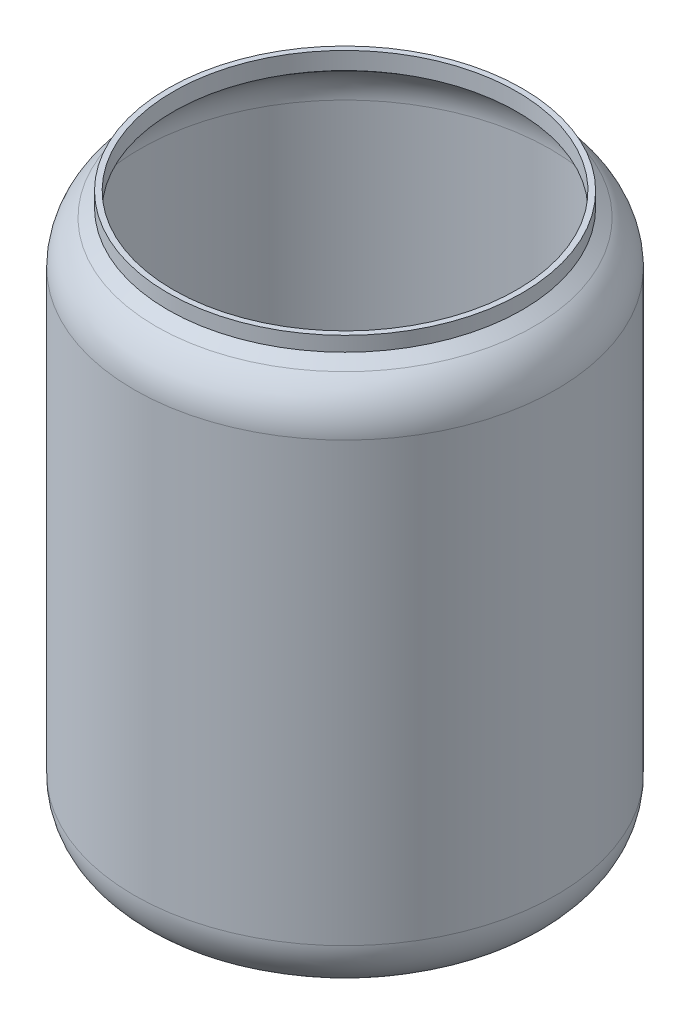
ISO-10303-21;
HEADER;
FILE_DESCRIPTION(('STEP AP214'),'2;1');
FILE_NAME('part.step','',(''),(''),'','','');
FILE_SCHEMA(('AUTOMOTIVE_DESIGN { 1 0 10303 214 1 1 1 1 }'));
ENDSEC;
DATA;
#1=APPLICATION_CONTEXT('core data for automotive mechanical design processes');
#2=APPLICATION_PROTOCOL_DEFINITION('international standard','automotive_design',2000,#1);
#3=PRODUCT_CONTEXT('',#1,'mechanical');
#4=PRODUCT('Part','Part','',(#3));
#5=PRODUCT_RELATED_PRODUCT_CATEGORY('part','',(#4));
#6=PRODUCT_DEFINITION_FORMATION('','',#4);
#7=PRODUCT_DEFINITION_CONTEXT('part definition',#1,'design');
#8=PRODUCT_DEFINITION('design','',#6,#7);
#9=PRODUCT_DEFINITION_SHAPE('','',#8);
#10=(LENGTH_UNIT() NAMED_UNIT(*) SI_UNIT(.MILLI.,.METRE.));
#11=(NAMED_UNIT(*) PLANE_ANGLE_UNIT() SI_UNIT($,.RADIAN.));
#12=(NAMED_UNIT(*) SI_UNIT($,.STERADIAN.) SOLID_ANGLE_UNIT());
#13=UNCERTAINTY_MEASURE_WITH_UNIT(LENGTH_MEASURE(1.E-05),#10,'distance_accuracy_value','');
#14=(GEOMETRIC_REPRESENTATION_CONTEXT(3) GLOBAL_UNCERTAINTY_ASSIGNED_CONTEXT((#13)) GLOBAL_UNIT_ASSIGNED_CONTEXT((#10,
#11,#12)) REPRESENTATION_CONTEXT('',''));
#15=CARTESIAN_POINT('',(0.,0.,0.));
#16=DIRECTION('',(0.,0.,1.));
#17=DIRECTION('',(1.,0.,0.));
#18=AXIS2_PLACEMENT_3D('',#15,#16,#17);
#19=CARTESIAN_POINT('',(28.9999999999999,1.,0.));
#20=DIRECTION('',(0.,-1.,0.));
#21=DIRECTION('',(0.,0.,-1.));
#22=AXIS2_PLACEMENT_3D('',#19,#20,#21);
#23=PLANE('',#22);
#24=CARTESIAN_POINT('',(0.,1.,0.));
#25=DIRECTION('',(0.,1.,0.));
#26=DIRECTION('',(0.,0.,1.));
#27=AXIS2_PLACEMENT_3D('',#24,#25,#26);
#28=CIRCLE('',#27,28.9999999999999);
#29=CARTESIAN_POINT('',(0.,1.,28.9999999999999));
#30=VERTEX_POINT('',#29);
#31=EDGE_CURVE('E10',#30,#30,#28,.T.);
#32=ORIENTED_EDGE('',*,*,#31,.T.);
#33=EDGE_LOOP('',(#32));
#34=FACE_BOUND('',#33,.T.);
#35=ADVANCED_FACE('F28',(#34),#23,.F.);
#36=CARTESIAN_POINT('',(0.,10.,0.));
#37=DIRECTION('',(0.,1.,0.));
#38=DIRECTION('',(0.,0.,1.));
#39=AXIS2_PLACEMENT_3D('',#36,#37,#38);
#40=TOROIDAL_SURFACE('',#39,29.,9.);
#41=ORIENTED_EDGE('',*,*,#31,.F.);
#42=EDGE_LOOP('',(#41));
#43=FACE_BOUND('',#42,.T.);
#44=CARTESIAN_POINT('',(0.,10.0000000000001,0.));
#45=DIRECTION('',(0.,1.,0.));
#46=DIRECTION('',(0.,0.,1.));
#47=AXIS2_PLACEMENT_3D('',#44,#45,#46);
#48=CIRCLE('',#47,38.);
#49=CARTESIAN_POINT('',(0.,10.0000000000001,38.));
#50=VERTEX_POINT('',#49);
#51=EDGE_CURVE('E34',#50,#50,#48,.T.);
#52=ORIENTED_EDGE('',*,*,#51,.T.);
#53=EDGE_LOOP('',(#52));
#54=FACE_BOUND('',#53,.T.);
#55=ADVANCED_FACE('F84',(#43,#54),#40,.F.);
#56=CARTESIAN_POINT('',(0.,85.7638888888889,0.));
#57=DIRECTION('',(0.,1.,0.));
#58=DIRECTION('',(0.,0.,1.));
#59=AXIS2_PLACEMENT_3D('',#56,#57,#58);
#60=CYLINDRICAL_SURFACE('',#59,38.);
#61=ORIENTED_EDGE('',*,*,#51,.F.);
#62=EDGE_LOOP('',(#61));
#63=FACE_BOUND('',#62,.T.);
#64=CARTESIAN_POINT('',(0.,90.9311994992868,0.));
#65=DIRECTION('',(0.,1.,0.));
#66=DIRECTION('',(0.,0.,1.));
#67=AXIS2_PLACEMENT_3D('',#64,#65,#66);
#68=CIRCLE('',#67,38.);
#69=CARTESIAN_POINT('',(0.,90.9311994992868,38.));
#70=VERTEX_POINT('',#69);
#71=EDGE_CURVE('E38',#70,#70,#68,.T.);
#72=ORIENTED_EDGE('',*,*,#71,.T.);
#73=EDGE_LOOP('',(#72));
#74=FACE_BOUND('',#73,.T.);
#75=ADVANCED_FACE('F88',(#63,#74),#60,.F.);
#76=CARTESIAN_POINT('',(0.,90.9311994992868,0.));
#77=DIRECTION('',(0.,1.,0.));
#78=DIRECTION('',(0.,0.,1.));
#79=AXIS2_PLACEMENT_3D('',#76,#77,#78);
#80=TOROIDAL_SURFACE('',#79,29.,9.);
#81=ORIENTED_EDGE('',*,*,#71,.F.);
#82=EDGE_LOOP('',(#81));
#83=FACE_BOUND('',#82,.T.);
#84=CARTESIAN_POINT('',(0.,98.1900443689291,0.));
#85=DIRECTION('',(0.,1.,0.));
#86=DIRECTION('',(0.,0.,1.));
#87=AXIS2_PLACEMENT_3D('',#84,#85,#86);
#88=CIRCLE('',#87,34.3206363490158);
#89=CARTESIAN_POINT('',(0.,98.1900443689291,34.3206363490158));
#90=VERTEX_POINT('',#89);
#91=EDGE_CURVE('E42',#90,#90,#88,.T.);
#92=ORIENTED_EDGE('',*,*,#91,.T.);
#93=EDGE_LOOP('',(#92));
#94=FACE_BOUND('',#93,.T.);
#95=ADVANCED_FACE('F93',(#83,#94),#80,.F.);
#96=CARTESIAN_POINT('',(0.,100.072316893314,0.));
#97=DIRECTION('',(0.,-1.,0.));
#98=DIRECTION('',(0.,0.,-1.));
#99=AXIS2_PLACEMENT_3D('',#96,#97,#98);
#100=CONICAL_SURFACE('',#99,31.7526870736574,0.938272976554357);
#101=ORIENTED_EDGE('',*,*,#91,.F.);
#102=EDGE_LOOP('',(#101));
#103=FACE_BOUND('',#102,.T.);
#104=CARTESIAN_POINT('',(0.,100.072316893314,0.));
#105=DIRECTION('',(0.,1.,0.));
#106=DIRECTION('',(0.,0.,1.));
#107=AXIS2_PLACEMENT_3D('',#104,#105,#106);
#108=CIRCLE('',#107,31.7526870736574);
#109=CARTESIAN_POINT('',(0.,100.072316893314,31.7526870736574));
#110=VERTEX_POINT('',#109);
#111=EDGE_CURVE('E47',#110,#110,#108,.T.);
#112=ORIENTED_EDGE('',*,*,#111,.T.);
#113=EDGE_LOOP('',(#112));
#114=FACE_BOUND('',#113,.T.);
#115=ADVANCED_FACE('F99',(#103,#114),#100,.F.);
#116=CARTESIAN_POINT('',(0.,85.7638888888889,0.));
#117=DIRECTION('',(0.,1.,0.));
#118=DIRECTION('',(0.,0.,1.));
#119=AXIS2_PLACEMENT_3D('',#116,#117,#118);
#120=CYLINDRICAL_SURFACE('',#119,31.7526870736574);
#121=ORIENTED_EDGE('',*,*,#111,.F.);
#122=EDGE_LOOP('',(#121));
#123=FACE_BOUND('',#122,.T.);
#124=CARTESIAN_POINT('',(0.,103.28846027419,0.));
#125=DIRECTION('',(0.,1.,0.));
#126=DIRECTION('',(0.,0.,1.));
#127=AXIS2_PLACEMENT_3D('',#124,#125,#126);
#128=CIRCLE('',#127,31.7526870736574);
#129=CARTESIAN_POINT('',(0.,103.28846027419,31.7526870736574));
#130=VERTEX_POINT('',#129);
#131=EDGE_CURVE('E50',#130,#130,#128,.T.);
#132=ORIENTED_EDGE('',*,*,#131,.T.);
#133=EDGE_LOOP('',(#132));
#134=FACE_BOUND('',#133,.T.);
#135=ADVANCED_FACE('F103',(#123,#134),#120,.F.);
#136=CARTESIAN_POINT('',(31.7526870736574,103.28846027419,0.));
#137=DIRECTION('',(0.,-1.,0.));
#138=DIRECTION('',(0.,0.,-1.));
#139=AXIS2_PLACEMENT_3D('',#136,#137,#138);
#140=PLANE('',#139);
#141=ORIENTED_EDGE('',*,*,#131,.F.);
#142=EDGE_LOOP('',(#141));
#143=FACE_BOUND('',#142,.T.);
#144=CARTESIAN_POINT('',(0.,103.28846027419,0.));
#145=DIRECTION('',(0.,1.,0.));
#146=DIRECTION('',(0.,0.,1.));
#147=AXIS2_PLACEMENT_3D('',#144,#145,#146);
#148=CIRCLE('',#147,32.7526870736574);
#149=CARTESIAN_POINT('',(0.,103.28846027419,32.7526870736574));
#150=VERTEX_POINT('',#149);
#151=EDGE_CURVE('E53',#150,#150,#148,.T.);
#152=ORIENTED_EDGE('',*,*,#151,.T.);
#153=EDGE_LOOP('',(#152));
#154=FACE_BOUND('',#153,.T.);
#155=ADVANCED_FACE('F107',(#143,#154),#140,.F.);
#156=CARTESIAN_POINT('',(0.,85.7638888888889,0.));
#157=DIRECTION('',(0.,1.,0.));
#158=DIRECTION('',(0.,0.,1.));
#159=AXIS2_PLACEMENT_3D('',#156,#157,#158);
#160=CYLINDRICAL_SURFACE('',#159,32.7526870736574);
#161=ORIENTED_EDGE('',*,*,#151,.F.);
#162=EDGE_LOOP('',(#161));
#163=FACE_BOUND('',#162,.T.);
#164=CARTESIAN_POINT('',(0.,100.579196943385,0.));
#165=DIRECTION('',(0.,1.,0.));
#166=DIRECTION('',(0.,0.,1.));
#167=AXIS2_PLACEMENT_3D('',#164,#165,#166);
#168=CIRCLE('',#167,32.7526870736574);
#169=CARTESIAN_POINT('',(0.,100.579196943385,32.7526870736574));
#170=VERTEX_POINT('',#169);
#171=EDGE_CURVE('E56',#170,#170,#168,.T.);
#172=ORIENTED_EDGE('',*,*,#171,.T.);
#173=EDGE_LOOP('',(#172));
#174=FACE_BOUND('',#173,.T.);
#175=ADVANCED_FACE('F111',(#163,#174),#160,.T.);
#176=CARTESIAN_POINT('',(0.,98.9965826877783,0.));
#177=DIRECTION('',(0.,-1.,0.));
#178=DIRECTION('',(0.,0.,-1.));
#179=AXIS2_PLACEMENT_3D('',#176,#177,#178);
#180=CONICAL_SURFACE('',#179,34.9118181655731,0.938272976554358);
#181=ORIENTED_EDGE('',*,*,#171,.F.);
#182=EDGE_LOOP('',(#181));
#183=FACE_BOUND('',#182,.T.);
#184=CARTESIAN_POINT('',(0.,98.9965826877783,0.));
#185=DIRECTION('',(0.,1.,0.));
#186=DIRECTION('',(0.,0.,1.));
#187=AXIS2_PLACEMENT_3D('',#184,#185,#186);
#188=CIRCLE('',#187,34.9118181655731);
#189=CARTESIAN_POINT('',(0.,98.9965826877783,34.9118181655731));
#190=VERTEX_POINT('',#189);
#191=EDGE_CURVE('E59',#190,#190,#188,.T.);
#192=ORIENTED_EDGE('',*,*,#191,.T.);
#193=EDGE_LOOP('',(#192));
#194=FACE_BOUND('',#193,.T.);
#195=ADVANCED_FACE('F115',(#183,#194),#180,.T.);
#196=CARTESIAN_POINT('',(0.,90.9311994992868,0.));
#197=DIRECTION('',(0.,1.,0.));
#198=DIRECTION('',(0.,0.,1.));
#199=AXIS2_PLACEMENT_3D('',#196,#197,#198);
#200=TOROIDAL_SURFACE('',#199,29.,10.);
#201=ORIENTED_EDGE('',*,*,#191,.F.);
#202=EDGE_LOOP('',(#201));
#203=FACE_BOUND('',#202,.T.);
#204=CARTESIAN_POINT('',(0.,90.9311994992868,0.));
#205=DIRECTION('',(0.,1.,0.));
#206=DIRECTION('',(0.,0.,1.));
#207=AXIS2_PLACEMENT_3D('',#204,#205,#206);
#208=CIRCLE('',#207,39.);
#209=CARTESIAN_POINT('',(0.,90.9311994992868,39.));
#210=VERTEX_POINT('',#209);
#211=EDGE_CURVE('E62',#210,#210,#208,.T.);
#212=ORIENTED_EDGE('',*,*,#211,.T.);
#213=EDGE_LOOP('',(#212));
#214=FACE_BOUND('',#213,.T.);
#215=ADVANCED_FACE('F119',(#203,#214),#200,.T.);
#216=CARTESIAN_POINT('',(0.,85.7638888888889,0.));
#217=DIRECTION('',(0.,1.,0.));
#218=DIRECTION('',(0.,0.,1.));
#219=AXIS2_PLACEMENT_3D('',#216,#217,#218);
#220=CYLINDRICAL_SURFACE('',#219,39.);
#221=ORIENTED_EDGE('',*,*,#211,.F.);
#222=EDGE_LOOP('',(#221));
#223=FACE_BOUND('',#222,.T.);
#224=CARTESIAN_POINT('',(0.,10.0000000000001,0.));
#225=DIRECTION('',(0.,1.,0.));
#226=DIRECTION('',(0.,0.,1.));
#227=AXIS2_PLACEMENT_3D('',#224,#225,#226);
#228=CIRCLE('',#227,39.);
#229=CARTESIAN_POINT('',(0.,10.0000000000001,39.));
#230=VERTEX_POINT('',#229);
#231=EDGE_CURVE('E65',#230,#230,#228,.T.);
#232=ORIENTED_EDGE('',*,*,#231,.T.);
#233=EDGE_LOOP('',(#232));
#234=FACE_BOUND('',#233,.T.);
#235=ADVANCED_FACE('F80',(#223,#234),#220,.T.);
#236=CARTESIAN_POINT('',(0.,10.,0.));
#237=DIRECTION('',(0.,1.,0.));
#238=DIRECTION('',(0.,0.,1.));
#239=AXIS2_PLACEMENT_3D('',#236,#237,#238);
#240=TOROIDAL_SURFACE('',#239,29.,10.);
#241=ORIENTED_EDGE('',*,*,#231,.F.);
#242=EDGE_LOOP('',(#241));
#243=FACE_BOUND('',#242,.T.);
#244=CARTESIAN_POINT('',(0.,0.,0.));
#245=DIRECTION('',(0.,1.,0.));
#246=DIRECTION('',(0.,0.,1.));
#247=AXIS2_PLACEMENT_3D('',#244,#245,#246);
#248=CIRCLE('',#247,28.9999999999999);
#249=CARTESIAN_POINT('',(0.,0.,28.9999999999999));
#250=VERTEX_POINT('',#249);
#251=EDGE_CURVE('E68',#250,#250,#248,.T.);
#252=ORIENTED_EDGE('',*,*,#251,.T.);
#253=EDGE_LOOP('',(#252));
#254=FACE_BOUND('',#253,.T.);
#255=ADVANCED_FACE('F72',(#243,#254),#240,.T.);
#256=CARTESIAN_POINT('',(28.9999999999999,0.,0.));
#257=DIRECTION('',(0.,1.,0.));
#258=DIRECTION('',(0.,0.,1.));
#259=AXIS2_PLACEMENT_3D('',#256,#257,#258);
#260=PLANE('',#259);
#261=ORIENTED_EDGE('',*,*,#251,.F.);
#262=EDGE_LOOP('',(#261));
#263=FACE_BOUND('',#262,.T.);
#264=ADVANCED_FACE('F74',(#263),#260,.F.);
#265=CLOSED_SHELL('',(#35,#55,#75,#95,#115,#135,#155,#175,#195,#215,#235,#255,#264));
#266=MANIFOLD_SOLID_BREP('B2',#265);
#267=ADVANCED_BREP_SHAPE_REPRESENTATION('',(#18,#266),#14);
#268=SHAPE_DEFINITION_REPRESENTATION(#9,#267);
ENDSEC;
END-ISO-10303-21;
